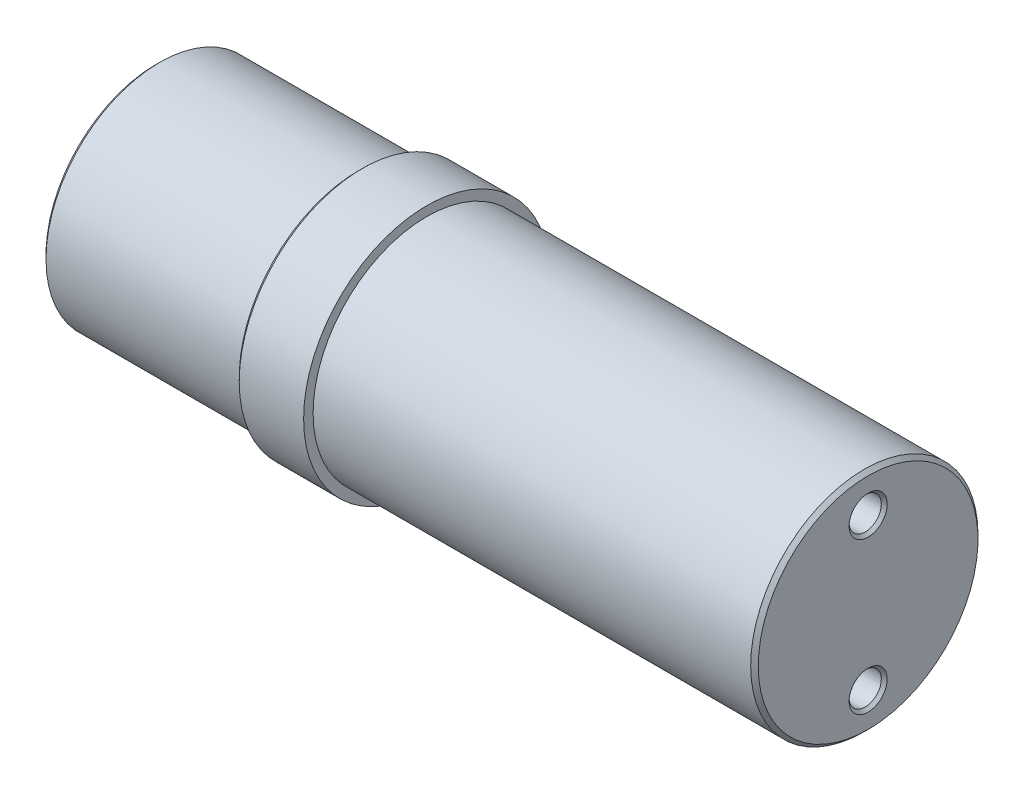
ISO-10303-21;
HEADER;
FILE_DESCRIPTION(('STEP AP214'),'2;1');
FILE_NAME('part.step','',(''),(''),'','','');
FILE_SCHEMA(('AUTOMOTIVE_DESIGN { 1 0 10303 214 1 1 1 1 }'));
ENDSEC;
DATA;
#1=APPLICATION_CONTEXT('core data for automotive mechanical design processes');
#2=APPLICATION_PROTOCOL_DEFINITION('international standard','automotive_design',2000,#1);
#3=PRODUCT_CONTEXT('',#1,'mechanical');
#4=PRODUCT('Part','Part','',(#3));
#5=PRODUCT_RELATED_PRODUCT_CATEGORY('part','',(#4));
#6=PRODUCT_DEFINITION_FORMATION('','',#4);
#7=PRODUCT_DEFINITION_CONTEXT('part definition',#1,'design');
#8=PRODUCT_DEFINITION('design','',#6,#7);
#9=PRODUCT_DEFINITION_SHAPE('','',#8);
#10=(LENGTH_UNIT() NAMED_UNIT(*) SI_UNIT(.MILLI.,.METRE.));
#11=(NAMED_UNIT(*) PLANE_ANGLE_UNIT() SI_UNIT($,.RADIAN.));
#12=(NAMED_UNIT(*) SI_UNIT($,.STERADIAN.) SOLID_ANGLE_UNIT());
#13=UNCERTAINTY_MEASURE_WITH_UNIT(LENGTH_MEASURE(1.E-05),#10,'distance_accuracy_value','');
#14=(GEOMETRIC_REPRESENTATION_CONTEXT(3) GLOBAL_UNCERTAINTY_ASSIGNED_CONTEXT((#13)) GLOBAL_UNIT_ASSIGNED_CONTEXT((#10,
#11,#12)) REPRESENTATION_CONTEXT('',''));
#15=CARTESIAN_POINT('',(0.,0.,0.));
#16=DIRECTION('',(0.,0.,1.));
#17=DIRECTION('',(1.,0.,0.));
#18=AXIS2_PLACEMENT_3D('',#15,#16,#17);
#19=CARTESIAN_POINT('',(0.,0.,0.));
#20=DIRECTION('',(-1.,0.,0.));
#21=DIRECTION('',(0.,0.,1.));
#22=AXIS2_PLACEMENT_3D('',#19,#20,#21);
#23=CYLINDRICAL_SURFACE('',#22,30.);
#24=CARTESIAN_POINT('',(0.999999999999963,0.,0.));
#25=DIRECTION('',(1.,0.,0.));
#26=DIRECTION('',(0.,0.,-1.));
#27=AXIS2_PLACEMENT_3D('',#24,#25,#26);
#28=CIRCLE('',#27,30.);
#29=CARTESIAN_POINT('',(0.999999999999963,0.,-30.));
#30=VERTEX_POINT('',#29);
#31=EDGE_CURVE('E11',#30,#30,#28,.T.);
#32=ORIENTED_EDGE('',*,*,#31,.T.);
#33=EDGE_LOOP('',(#32));
#34=FACE_BOUND('',#33,.T.);
#35=CARTESIAN_POINT('',(53.5,0.,0.));
#36=DIRECTION('',(-1.,0.,0.));
#37=DIRECTION('',(0.,0.,1.));
#38=AXIS2_PLACEMENT_3D('',#35,#36,#37);
#39=CIRCLE('',#38,30.);
#40=CARTESIAN_POINT('',(53.5,0.,30.));
#41=VERTEX_POINT('',#40);
#42=EDGE_CURVE('E125',#41,#41,#39,.T.);
#43=ORIENTED_EDGE('',*,*,#42,.T.);
#44=EDGE_LOOP('',(#43));
#45=FACE_BOUND('',#44,.T.);
#46=ADVANCED_FACE('F46',(#34,#45),#23,.T.);
#47=CARTESIAN_POINT('',(0.,0.,0.));
#48=DIRECTION('',(1.,0.,0.));
#49=DIRECTION('',(0.,0.,-1.));
#50=AXIS2_PLACEMENT_3D('',#47,#48,#49);
#51=PLANE('',#50);
#52=CARTESIAN_POINT('',(0.,0.,0.));
#53=DIRECTION('',(1.,0.,0.));
#54=DIRECTION('',(0.,0.,-1.));
#55=AXIS2_PLACEMENT_3D('',#52,#53,#54);
#56=CIRCLE('',#55,29.);
#57=CARTESIAN_POINT('',(0.,0.,-29.));
#58=VERTEX_POINT('',#57);
#59=EDGE_CURVE('E56',#58,#58,#56,.F.);
#60=ORIENTED_EDGE('',*,*,#59,.T.);
#61=EDGE_LOOP('',(#60));
#62=FACE_BOUND('',#61,.T.);
#63=CARTESIAN_POINT('',(0.,20.,0.));
#64=DIRECTION('',(-1.,0.,0.));
#65=DIRECTION('',(0.,0.,1.));
#66=AXIS2_PLACEMENT_3D('',#63,#64,#65);
#67=CIRCLE('',#66,5.025);
#68=CARTESIAN_POINT('',(0.,20.,5.025));
#69=VERTEX_POINT('',#68);
#70=EDGE_CURVE('E101',#69,#69,#67,.T.);
#71=ORIENTED_EDGE('',*,*,#70,.F.);
#72=EDGE_LOOP('',(#71));
#73=FACE_BOUND('',#72,.T.);
#74=CARTESIAN_POINT('',(0.,-20.,0.));
#75=DIRECTION('',(-1.,0.,0.));
#76=DIRECTION('',(0.,0.,1.));
#77=AXIS2_PLACEMENT_3D('',#74,#75,#76);
#78=CIRCLE('',#77,5.025);
#79=CARTESIAN_POINT('',(0.,-20.,5.025));
#80=VERTEX_POINT('',#79);
#81=EDGE_CURVE('E113',#80,#80,#78,.T.);
#82=ORIENTED_EDGE('',*,*,#81,.F.);
#83=EDGE_LOOP('',(#82));
#84=FACE_BOUND('',#83,.T.);
#85=ADVANCED_FACE('F157',(#62,#73,#84),#51,.F.);
#86=CARTESIAN_POINT('',(188.,30.,0.));
#87=DIRECTION('',(-1.,0.,0.));
#88=DIRECTION('',(0.,0.,1.));
#89=AXIS2_PLACEMENT_3D('',#86,#87,#88);
#90=PLANE('',#89);
#91=CARTESIAN_POINT('',(188.,0.,0.));
#92=DIRECTION('',(-1.,0.,0.));
#93=DIRECTION('',(0.,0.,1.));
#94=AXIS2_PLACEMENT_3D('',#91,#92,#93);
#95=CIRCLE('',#94,29.);
#96=CARTESIAN_POINT('',(188.,0.,29.));
#97=VERTEX_POINT('',#96);
#98=EDGE_CURVE('E149',#97,#97,#95,.F.);
#99=ORIENTED_EDGE('',*,*,#98,.T.);
#100=EDGE_LOOP('',(#99));
#101=FACE_BOUND('',#100,.T.);
#102=CARTESIAN_POINT('',(188.,20.,0.));
#103=DIRECTION('',(1.,0.,0.));
#104=DIRECTION('',(0.,0.,-1.));
#105=AXIS2_PLACEMENT_3D('',#102,#103,#104);
#106=CIRCLE('',#105,5.025);
#107=CARTESIAN_POINT('',(188.,20.,-5.025));
#108=VERTEX_POINT('',#107);
#109=EDGE_CURVE('E90',#108,#108,#106,.T.);
#110=ORIENTED_EDGE('',*,*,#109,.F.);
#111=EDGE_LOOP('',(#110));
#112=FACE_BOUND('',#111,.T.);
#113=CARTESIAN_POINT('',(188.,-20.,0.));
#114=DIRECTION('',(1.,0.,0.));
#115=DIRECTION('',(0.,0.,-1.));
#116=AXIS2_PLACEMENT_3D('',#113,#114,#115);
#117=CIRCLE('',#116,5.025);
#118=CARTESIAN_POINT('',(188.,-20.,-5.025));
#119=VERTEX_POINT('',#118);
#120=EDGE_CURVE('E80',#119,#119,#117,.T.);
#121=ORIENTED_EDGE('',*,*,#120,.F.);
#122=EDGE_LOOP('',(#121));
#123=FACE_BOUND('',#122,.T.);
#124=ADVANCED_FACE('F175',(#101,#112,#123),#90,.F.);
#125=CARTESIAN_POINT('',(0.,0.,0.));
#126=DIRECTION('',(-1.,0.,0.));
#127=DIRECTION('',(0.,0.,1.));
#128=AXIS2_PLACEMENT_3D('',#125,#126,#127);
#129=CYLINDRICAL_SURFACE('',#128,30.);
#130=CARTESIAN_POINT('',(187.,0.,0.));
#131=DIRECTION('',(-1.,0.,0.));
#132=DIRECTION('',(0.,0.,1.));
#133=AXIS2_PLACEMENT_3D('',#130,#131,#132);
#134=CIRCLE('',#133,30.);
#135=CARTESIAN_POINT('',(187.,0.,30.));
#136=VERTEX_POINT('',#135);
#137=EDGE_CURVE('E145',#136,#136,#134,.T.);
#138=ORIENTED_EDGE('',*,*,#137,.T.);
#139=EDGE_LOOP('',(#138));
#140=FACE_BOUND('',#139,.T.);
#141=CARTESIAN_POINT('',(71.5,0.,0.));
#142=DIRECTION('',(-1.,0.,0.));
#143=DIRECTION('',(0.,0.,1.));
#144=AXIS2_PLACEMENT_3D('',#141,#142,#143);
#145=CIRCLE('',#144,30.);
#146=CARTESIAN_POINT('',(71.5,0.,30.));
#147=VERTEX_POINT('',#146);
#148=EDGE_CURVE('E133',#147,#147,#145,.T.);
#149=ORIENTED_EDGE('',*,*,#148,.F.);
#150=EDGE_LOOP('',(#149));
#151=FACE_BOUND('',#150,.T.);
#152=ADVANCED_FACE('F220',(#140,#151),#129,.T.);
#153=CARTESIAN_POINT('',(71.5,32.5,0.));
#154=DIRECTION('',(-1.,0.,0.));
#155=DIRECTION('',(0.,0.,1.));
#156=AXIS2_PLACEMENT_3D('',#153,#154,#155);
#157=PLANE('',#156);
#158=CARTESIAN_POINT('',(71.5,0.,0.));
#159=DIRECTION('',(-1.,0.,0.));
#160=DIRECTION('',(0.,0.,1.));
#161=AXIS2_PLACEMENT_3D('',#158,#159,#160);
#162=CIRCLE('',#161,32.5);
#163=CARTESIAN_POINT('',(71.5,0.,32.5));
#164=VERTEX_POINT('',#163);
#165=EDGE_CURVE('E129',#164,#164,#162,.T.);
#166=ORIENTED_EDGE('',*,*,#165,.F.);
#167=EDGE_LOOP('',(#166));
#168=FACE_BOUND('',#167,.T.);
#169=ORIENTED_EDGE('',*,*,#148,.T.);
#170=EDGE_LOOP('',(#169));
#171=FACE_BOUND('',#170,.T.);
#172=ADVANCED_FACE('F213',(#168,#171),#157,.F.);
#173=CARTESIAN_POINT('',(0.,0.,0.));
#174=DIRECTION('',(-1.,0.,0.));
#175=DIRECTION('',(0.,0.,1.));
#176=AXIS2_PLACEMENT_3D('',#173,#174,#175);
#177=CYLINDRICAL_SURFACE('',#176,32.5);
#178=CARTESIAN_POINT('',(54.5,0.,0.));
#179=DIRECTION('',(1.,0.,0.));
#180=DIRECTION('',(0.,0.,-1.));
#181=AXIS2_PLACEMENT_3D('',#178,#179,#180);
#182=CIRCLE('',#181,32.5);
#183=CARTESIAN_POINT('',(54.5,0.,-32.5));
#184=VERTEX_POINT('',#183);
#185=EDGE_CURVE('E141',#184,#184,#182,.T.);
#186=ORIENTED_EDGE('',*,*,#185,.T.);
#187=EDGE_LOOP('',(#186));
#188=FACE_BOUND('',#187,.T.);
#189=ORIENTED_EDGE('',*,*,#165,.T.);
#190=EDGE_LOOP('',(#189));
#191=FACE_BOUND('',#190,.T.);
#192=ADVANCED_FACE('F204',(#188,#191),#177,.T.);
#193=CARTESIAN_POINT('',(53.5,30.,0.));
#194=DIRECTION('',(1.,0.,0.));
#195=DIRECTION('',(0.,0.,-1.));
#196=AXIS2_PLACEMENT_3D('',#193,#194,#195);
#197=PLANE('',#196);
#198=CARTESIAN_POINT('',(53.5,0.,0.));
#199=DIRECTION('',(1.,0.,0.));
#200=DIRECTION('',(0.,0.,-1.));
#201=AXIS2_PLACEMENT_3D('',#198,#199,#200);
#202=CIRCLE('',#201,31.5000000000001);
#203=CARTESIAN_POINT('',(53.5,0.,-31.5000000000001));
#204=VERTEX_POINT('',#203);
#205=EDGE_CURVE('E137',#204,#204,#202,.F.);
#206=ORIENTED_EDGE('',*,*,#205,.T.);
#207=EDGE_LOOP('',(#206));
#208=FACE_BOUND('',#207,.T.);
#209=ORIENTED_EDGE('',*,*,#42,.F.);
#210=EDGE_LOOP('',(#209));
#211=FACE_BOUND('',#210,.T.);
#212=ADVANCED_FACE('F200',(#208,#211),#197,.F.);
#213=CARTESIAN_POINT('',(24.5,-20.,0.));
#214=DIRECTION('',(-1.,0.,0.));
#215=DIRECTION('',(0.,0.,1.));
#216=AXIS2_PLACEMENT_3D('',#213,#214,#215);
#217=CONICAL_SURFACE('',#216,4.24999999999999,1.02974425867665);
#218=CARTESIAN_POINT('',(27.0536576308671,-20.,0.));
#219=VERTEX_POINT('',#218);
#220=VERTEX_LOOP('',#219);
#221=FACE_BOUND('',#220,.T.);
#222=CARTESIAN_POINT('',(24.5,-20.,0.));
#223=DIRECTION('',(-1.,0.,0.));
#224=DIRECTION('',(0.,0.,1.));
#225=AXIS2_PLACEMENT_3D('',#222,#223,#224);
#226=CIRCLE('',#225,4.24999999999999);
#227=CARTESIAN_POINT('',(24.5,-20.,4.25));
#228=VERTEX_POINT('',#227);
#229=EDGE_CURVE('E121',#228,#228,#226,.T.);
#230=ORIENTED_EDGE('',*,*,#229,.T.);
#231=EDGE_LOOP('',(#230));
#232=FACE_BOUND('',#231,.T.);
#233=ADVANCED_FACE('F203',(#221,#232),#217,.F.);
#234=CARTESIAN_POINT('',(0.,-20.,0.));
#235=DIRECTION('',(-1.,0.,0.));
#236=DIRECTION('',(0.,0.,1.));
#237=AXIS2_PLACEMENT_3D('',#234,#235,#236);
#238=CYLINDRICAL_SURFACE('',#237,4.24999999999999);
#239=ORIENTED_EDGE('',*,*,#229,.F.);
#240=EDGE_LOOP('',(#239));
#241=FACE_BOUND('',#240,.T.);
#242=CARTESIAN_POINT('',(0.775000000000001,-20.,0.));
#243=DIRECTION('',(-1.,0.,0.));
#244=DIRECTION('',(0.,0.,1.));
#245=AXIS2_PLACEMENT_3D('',#242,#243,#244);
#246=CIRCLE('',#245,4.25);
#247=CARTESIAN_POINT('',(0.775000000000001,-20.,4.25));
#248=VERTEX_POINT('',#247);
#249=EDGE_CURVE('E117',#248,#248,#246,.T.);
#250=ORIENTED_EDGE('',*,*,#249,.T.);
#251=EDGE_LOOP('',(#250));
#252=FACE_BOUND('',#251,.T.);
#253=ADVANCED_FACE('F211',(#241,#252),#238,.F.);
#254=CARTESIAN_POINT('',(0.,-20.,0.));
#255=DIRECTION('',(-1.,0.,0.));
#256=DIRECTION('',(0.,0.,1.));
#257=AXIS2_PLACEMENT_3D('',#254,#255,#256);
#258=CONICAL_SURFACE('',#257,5.025,0.78539816339745);
#259=ORIENTED_EDGE('',*,*,#249,.F.);
#260=EDGE_LOOP('',(#259));
#261=FACE_BOUND('',#260,.T.);
#262=ORIENTED_EDGE('',*,*,#81,.T.);
#263=EDGE_LOOP('',(#262));
#264=FACE_BOUND('',#263,.T.);
#265=ADVANCED_FACE('F262',(#261,#264),#258,.F.);
#266=CARTESIAN_POINT('',(24.5,20.,0.));
#267=DIRECTION('',(-1.,0.,0.));
#268=DIRECTION('',(0.,0.,1.));
#269=AXIS2_PLACEMENT_3D('',#266,#267,#268);
#270=CONICAL_SURFACE('',#269,4.24999999999999,1.02974425867665);
#271=CARTESIAN_POINT('',(27.0536576308671,20.,0.));
#272=VERTEX_POINT('',#271);
#273=VERTEX_LOOP('',#272);
#274=FACE_BOUND('',#273,.T.);
#275=CARTESIAN_POINT('',(24.5,20.,0.));
#276=DIRECTION('',(-1.,0.,0.));
#277=DIRECTION('',(0.,0.,1.));
#278=AXIS2_PLACEMENT_3D('',#275,#276,#277);
#279=CIRCLE('',#278,4.24999999999999);
#280=CARTESIAN_POINT('',(24.5,20.,4.25));
#281=VERTEX_POINT('',#280);
#282=EDGE_CURVE('E109',#281,#281,#279,.T.);
#283=ORIENTED_EDGE('',*,*,#282,.T.);
#284=EDGE_LOOP('',(#283));
#285=FACE_BOUND('',#284,.T.);
#286=ADVANCED_FACE('F258',(#274,#285),#270,.F.);
#287=CARTESIAN_POINT('',(0.,20.,0.));
#288=DIRECTION('',(-1.,0.,0.));
#289=DIRECTION('',(0.,0.,1.));
#290=AXIS2_PLACEMENT_3D('',#287,#288,#289);
#291=CYLINDRICAL_SURFACE('',#290,4.24999999999999);
#292=ORIENTED_EDGE('',*,*,#282,.F.);
#293=EDGE_LOOP('',(#292));
#294=FACE_BOUND('',#293,.T.);
#295=CARTESIAN_POINT('',(0.775000000000001,20.,0.));
#296=DIRECTION('',(-1.,0.,0.));
#297=DIRECTION('',(0.,0.,1.));
#298=AXIS2_PLACEMENT_3D('',#295,#296,#297);
#299=CIRCLE('',#298,4.25);
#300=CARTESIAN_POINT('',(0.775000000000001,20.,4.25));
#301=VERTEX_POINT('',#300);
#302=EDGE_CURVE('E105',#301,#301,#299,.T.);
#303=ORIENTED_EDGE('',*,*,#302,.T.);
#304=EDGE_LOOP('',(#303));
#305=FACE_BOUND('',#304,.T.);
#306=ADVANCED_FACE('F254',(#294,#305),#291,.F.);
#307=CARTESIAN_POINT('',(0.,20.,0.));
#308=DIRECTION('',(-1.,0.,0.));
#309=DIRECTION('',(0.,0.,1.));
#310=AXIS2_PLACEMENT_3D('',#307,#308,#309);
#311=CONICAL_SURFACE('',#310,5.025,0.78539816339745);
#312=ORIENTED_EDGE('',*,*,#302,.F.);
#313=EDGE_LOOP('',(#312));
#314=FACE_BOUND('',#313,.T.);
#315=ORIENTED_EDGE('',*,*,#70,.T.);
#316=EDGE_LOOP('',(#315));
#317=FACE_BOUND('',#316,.T.);
#318=ADVANCED_FACE('F250',(#314,#317),#311,.F.);
#319=CARTESIAN_POINT('',(163.5,-20.,0.));
#320=DIRECTION('',(1.,0.,0.));
#321=DIRECTION('',(0.,0.,-1.));
#322=AXIS2_PLACEMENT_3D('',#319,#320,#321);
#323=CONICAL_SURFACE('',#322,4.24999999999999,1.02974425867665);
#324=CARTESIAN_POINT('',(160.946342369133,-20.,0.));
#325=VERTEX_POINT('',#324);
#326=VERTEX_LOOP('',#325);
#327=FACE_BOUND('',#326,.T.);
#328=CARTESIAN_POINT('',(163.5,-20.,0.));
#329=DIRECTION('',(1.,0.,0.));
#330=DIRECTION('',(0.,0.,-1.));
#331=AXIS2_PLACEMENT_3D('',#328,#329,#330);
#332=CIRCLE('',#331,4.24999999999999);
#333=CARTESIAN_POINT('',(163.5,-20.,-4.25));
#334=VERTEX_POINT('',#333);
#335=EDGE_CURVE('E97',#334,#334,#332,.T.);
#336=ORIENTED_EDGE('',*,*,#335,.T.);
#337=EDGE_LOOP('',(#336));
#338=FACE_BOUND('',#337,.T.);
#339=ADVANCED_FACE('F242',(#327,#338),#323,.F.);
#340=CARTESIAN_POINT('',(188.,-20.,0.));
#341=DIRECTION('',(1.,0.,0.));
#342=DIRECTION('',(0.,0.,-1.));
#343=AXIS2_PLACEMENT_3D('',#340,#341,#342);
#344=CYLINDRICAL_SURFACE('',#343,4.24999999999999);
#345=ORIENTED_EDGE('',*,*,#335,.F.);
#346=EDGE_LOOP('',(#345));
#347=FACE_BOUND('',#346,.T.);
#348=CARTESIAN_POINT('',(187.225,-20.,0.));
#349=DIRECTION('',(1.,0.,0.));
#350=DIRECTION('',(0.,0.,-1.));
#351=AXIS2_PLACEMENT_3D('',#348,#349,#350);
#352=CIRCLE('',#351,4.25);
#353=CARTESIAN_POINT('',(187.225,-20.,-4.25));
#354=VERTEX_POINT('',#353);
#355=EDGE_CURVE('E87',#354,#354,#352,.T.);
#356=ORIENTED_EDGE('',*,*,#355,.T.);
#357=EDGE_LOOP('',(#356));
#358=FACE_BOUND('',#357,.T.);
#359=ADVANCED_FACE('F236',(#347,#358),#344,.F.);
#360=CARTESIAN_POINT('',(188.,-20.,0.));
#361=DIRECTION('',(1.,0.,0.));
#362=DIRECTION('',(0.,0.,-1.));
#363=AXIS2_PLACEMENT_3D('',#360,#361,#362);
#364=CONICAL_SURFACE('',#363,5.025,0.785398163397453);
#365=ORIENTED_EDGE('',*,*,#355,.F.);
#366=EDGE_LOOP('',(#365));
#367=FACE_BOUND('',#366,.T.);
#368=ORIENTED_EDGE('',*,*,#120,.T.);
#369=EDGE_LOOP('',(#368));
#370=FACE_BOUND('',#369,.T.);
#371=ADVANCED_FACE('F73',(#367,#370),#364,.F.);
#372=CARTESIAN_POINT('',(163.5,20.,0.));
#373=DIRECTION('',(1.,0.,0.));
#374=DIRECTION('',(0.,0.,-1.));
#375=AXIS2_PLACEMENT_3D('',#372,#373,#374);
#376=CONICAL_SURFACE('',#375,4.24999999999999,1.02974425867665);
#377=CARTESIAN_POINT('',(160.946342369133,20.,0.));
#378=VERTEX_POINT('',#377);
#379=VERTEX_LOOP('',#378);
#380=FACE_BOUND('',#379,.T.);
#381=CARTESIAN_POINT('',(163.5,20.,0.));
#382=DIRECTION('',(1.,0.,0.));
#383=DIRECTION('',(0.,0.,-1.));
#384=AXIS2_PLACEMENT_3D('',#381,#382,#383);
#385=CIRCLE('',#384,4.24999999999999);
#386=CARTESIAN_POINT('',(163.5,20.,-4.24999999999999));
#387=VERTEX_POINT('',#386);
#388=EDGE_CURVE('E77',#387,#387,#385,.T.);
#389=ORIENTED_EDGE('',*,*,#388,.T.);
#390=EDGE_LOOP('',(#389));
#391=FACE_BOUND('',#390,.T.);
#392=ADVANCED_FACE('F69',(#380,#391),#376,.F.);
#393=CARTESIAN_POINT('',(188.,20.,0.));
#394=DIRECTION('',(1.,0.,0.));
#395=DIRECTION('',(0.,0.,-1.));
#396=AXIS2_PLACEMENT_3D('',#393,#394,#395);
#397=CYLINDRICAL_SURFACE('',#396,4.24999999999999);
#398=ORIENTED_EDGE('',*,*,#388,.F.);
#399=EDGE_LOOP('',(#398));
#400=FACE_BOUND('',#399,.T.);
#401=CARTESIAN_POINT('',(187.225,20.,0.));
#402=DIRECTION('',(1.,0.,0.));
#403=DIRECTION('',(0.,0.,-1.));
#404=AXIS2_PLACEMENT_3D('',#401,#402,#403);
#405=CIRCLE('',#404,4.25);
#406=CARTESIAN_POINT('',(187.225,20.,-4.24999999999999));
#407=VERTEX_POINT('',#406);
#408=EDGE_CURVE('E81',#407,#407,#405,.T.);
#409=ORIENTED_EDGE('',*,*,#408,.T.);
#410=EDGE_LOOP('',(#409));
#411=FACE_BOUND('',#410,.T.);
#412=ADVANCED_FACE('F72',(#400,#411),#397,.F.);
#413=CARTESIAN_POINT('',(188.,20.,0.));
#414=DIRECTION('',(1.,0.,0.));
#415=DIRECTION('',(0.,0.,-1.));
#416=AXIS2_PLACEMENT_3D('',#413,#414,#415);
#417=CONICAL_SURFACE('',#416,5.025,0.785398163397453);
#418=ORIENTED_EDGE('',*,*,#408,.F.);
#419=EDGE_LOOP('',(#418));
#420=FACE_BOUND('',#419,.T.);
#421=ORIENTED_EDGE('',*,*,#109,.T.);
#422=EDGE_LOOP('',(#421));
#423=FACE_BOUND('',#422,.T.);
#424=ADVANCED_FACE('F185',(#420,#423),#417,.F.);
#425=CARTESIAN_POINT('',(53.5,0.,0.));
#426=DIRECTION('',(1.,0.,0.));
#427=DIRECTION('',(0.,0.,-1.));
#428=AXIS2_PLACEMENT_3D('',#425,#426,#427);
#429=CONICAL_SURFACE('',#428,31.5000000000001,0.785398163397445);
#430=ORIENTED_EDGE('',*,*,#185,.F.);
#431=EDGE_LOOP('',(#430));
#432=FACE_BOUND('',#431,.T.);
#433=ORIENTED_EDGE('',*,*,#205,.F.);
#434=EDGE_LOOP('',(#433));
#435=FACE_BOUND('',#434,.T.);
#436=ADVANCED_FACE('F166',(#432,#435),#429,.T.);
#437=CARTESIAN_POINT('',(187.,0.,0.));
#438=DIRECTION('',(-1.,0.,0.));
#439=DIRECTION('',(0.,0.,1.));
#440=AXIS2_PLACEMENT_3D('',#437,#438,#439);
#441=CONICAL_SURFACE('',#440,30.,0.785398163397436);
#442=ORIENTED_EDGE('',*,*,#98,.F.);
#443=EDGE_LOOP('',(#442));
#444=FACE_BOUND('',#443,.T.);
#445=ORIENTED_EDGE('',*,*,#137,.F.);
#446=EDGE_LOOP('',(#445));
#447=FACE_BOUND('',#446,.T.);
#448=ADVANCED_FACE('F161',(#444,#447),#441,.T.);
#449=CARTESIAN_POINT('',(0.,0.,0.));
#450=DIRECTION('',(1.,0.,0.));
#451=DIRECTION('',(0.,0.,-1.));
#452=AXIS2_PLACEMENT_3D('',#449,#450,#451);
#453=CONICAL_SURFACE('',#452,29.,0.785398163397453);
#454=ORIENTED_EDGE('',*,*,#31,.F.);
#455=EDGE_LOOP('',(#454));
#456=FACE_BOUND('',#455,.T.);
#457=ORIENTED_EDGE('',*,*,#59,.F.);
#458=EDGE_LOOP('',(#457));
#459=FACE_BOUND('',#458,.T.);
#460=ADVANCED_FACE('F49',(#456,#459),#453,.T.);
#461=CLOSED_SHELL('',(#46,#85,#124,#152,#172,#192,#212,#233,#253,#265,#286,#306,#318,#339,#359,
#371,#392,#412,#424,#436,#448,#460));
#462=MANIFOLD_SOLID_BREP('B2',#461);
#463=ADVANCED_BREP_SHAPE_REPRESENTATION('',(#18,#462),#14);
#464=SHAPE_DEFINITION_REPRESENTATION(#9,#463);
ENDSEC;
END-ISO-10303-21;
